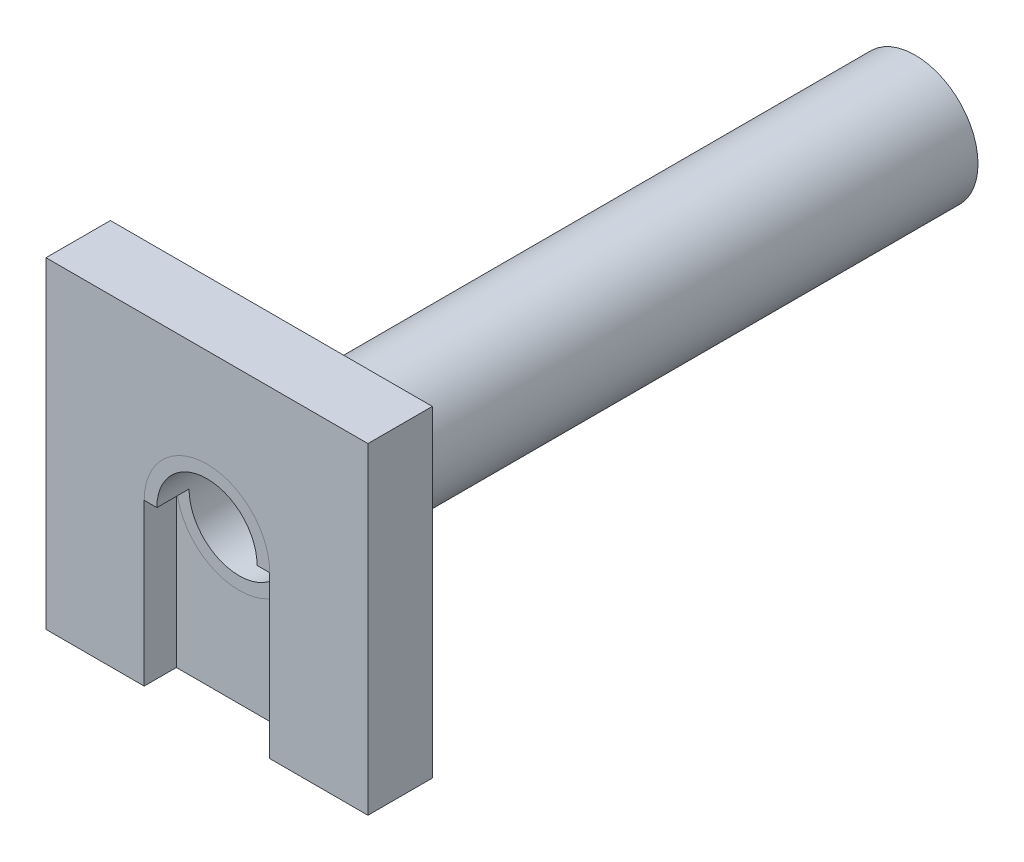
ISO-10303-21;
HEADER;
FILE_DESCRIPTION(('STEP AP214'),'2;1');
FILE_NAME('part.step','',(''),(''),'','','');
FILE_SCHEMA(('AUTOMOTIVE_DESIGN { 1 0 10303 214 1 1 1 1 }'));
ENDSEC;
DATA;
#1=APPLICATION_CONTEXT('core data for automotive mechanical design processes');
#2=APPLICATION_PROTOCOL_DEFINITION('international standard','automotive_design',2000,#1);
#3=PRODUCT_CONTEXT('',#1,'mechanical');
#4=PRODUCT('Part','Part','',(#3));
#5=PRODUCT_RELATED_PRODUCT_CATEGORY('part','',(#4));
#6=PRODUCT_DEFINITION_FORMATION('','',#4);
#7=PRODUCT_DEFINITION_CONTEXT('part definition',#1,'design');
#8=PRODUCT_DEFINITION('design','',#6,#7);
#9=PRODUCT_DEFINITION_SHAPE('','',#8);
#10=(LENGTH_UNIT() NAMED_UNIT(*) SI_UNIT(.MILLI.,.METRE.));
#11=(NAMED_UNIT(*) PLANE_ANGLE_UNIT() SI_UNIT($,.RADIAN.));
#12=(NAMED_UNIT(*) SI_UNIT($,.STERADIAN.) SOLID_ANGLE_UNIT());
#13=UNCERTAINTY_MEASURE_WITH_UNIT(LENGTH_MEASURE(1.E-05),#10,'distance_accuracy_value','');
#14=(GEOMETRIC_REPRESENTATION_CONTEXT(3) GLOBAL_UNCERTAINTY_ASSIGNED_CONTEXT((#13)) GLOBAL_UNIT_ASSIGNED_CONTEXT((#10,
#11,#12)) REPRESENTATION_CONTEXT('',''));
#15=CARTESIAN_POINT('',(0.,0.,0.));
#16=DIRECTION('',(0.,0.,1.));
#17=DIRECTION('',(1.,0.,0.));
#18=AXIS2_PLACEMENT_3D('',#15,#16,#17);
#19=CARTESIAN_POINT('',(-9.68665057002543,-7.7,50.8));
#20=DIRECTION('',(0.,1.,0.));
#21=DIRECTION('',(-1.,0.,0.));
#22=AXIS2_PLACEMENT_3D('',#19,#20,#21);
#23=PLANE('',#22);
#24=DIRECTION('',(0.,0.,1.));
#25=VECTOR('',#24,1.);
#26=CARTESIAN_POINT('',(4.953,-7.7,53.34));
#27=LINE('',#26,#25);
#28=CARTESIAN_POINT('',(4.953,-7.7,53.34));
#29=VERTEX_POINT('',#28);
#30=CARTESIAN_POINT('',(4.953,-7.7,55.88));
#31=VERTEX_POINT('',#30);
#32=EDGE_CURVE('E135',#29,#31,#27,.T.);
#33=ORIENTED_EDGE('',*,*,#32,.F.);
#34=DIRECTION('',(-1.,0.,0.));
#35=VECTOR('',#34,1.);
#36=CARTESIAN_POINT('',(4.953,-7.7,53.34));
#37=LINE('',#36,#35);
#38=CARTESIAN_POINT('',(-4.953,-7.7,53.34));
#39=VERTEX_POINT('',#38);
#40=EDGE_CURVE('E121',#29,#39,#37,.T.);
#41=ORIENTED_EDGE('',*,*,#40,.T.);
#42=DIRECTION('',(0.,0.,1.));
#43=VECTOR('',#42,1.);
#44=CARTESIAN_POINT('',(-4.953,-7.7,53.34));
#45=LINE('',#44,#43);
#46=CARTESIAN_POINT('',(-4.953,-7.7,55.88));
#47=VERTEX_POINT('',#46);
#48=EDGE_CURVE('E139',#39,#47,#45,.T.);
#49=ORIENTED_EDGE('',*,*,#48,.T.);
#50=DIRECTION('',(-1.,0.,0.));
#51=VECTOR('',#50,1.);
#52=CARTESIAN_POINT('',(-9.68665057002543,-7.7,55.88));
#53=LINE('',#52,#51);
#54=CARTESIAN_POINT('',(-12.7,-7.7,55.88));
#55=VERTEX_POINT('',#54);
#56=EDGE_CURVE('E161',#47,#55,#53,.T.);
#57=ORIENTED_EDGE('',*,*,#56,.T.);
#58=DIRECTION('',(0.,0.,1.));
#59=VECTOR('',#58,1.);
#60=CARTESIAN_POINT('',(-12.7,-7.7,50.8));
#61=LINE('',#60,#59);
#62=CARTESIAN_POINT('',(-12.7,-7.7,50.8));
#63=VERTEX_POINT('',#62);
#64=EDGE_CURVE('E159',#63,#55,#61,.T.);
#65=ORIENTED_EDGE('',*,*,#64,.F.);
#66=DIRECTION('',(-1.,0.,0.));
#67=VECTOR('',#66,1.);
#68=CARTESIAN_POINT('',(-9.68665057002543,-7.7,50.8));
#69=LINE('',#68,#67);
#70=CARTESIAN_POINT('',(12.7,-7.69999999999999,50.8));
#71=VERTEX_POINT('',#70);
#72=EDGE_CURVE('E92',#71,#63,#69,.T.);
#73=ORIENTED_EDGE('',*,*,#72,.F.);
#74=DIRECTION('',(0.,0.,1.));
#75=VECTOR('',#74,1.);
#76=CARTESIAN_POINT('',(12.7,-7.69999999999999,50.8));
#77=LINE('',#76,#75);
#78=CARTESIAN_POINT('',(12.7,-7.69999999999999,55.88));
#79=VERTEX_POINT('',#78);
#80=EDGE_CURVE('E175',#71,#79,#77,.T.);
#81=ORIENTED_EDGE('',*,*,#80,.T.);
#82=EDGE_CURVE('E162',#79,#31,#53,.T.);
#83=ORIENTED_EDGE('',*,*,#82,.T.);
#84=EDGE_LOOP('',(#33,#41,#49,#57,#65,#73,#81,#83));
#85=FACE_BOUND('',#84,.T.);
#86=ADVANCED_FACE('F42',(#85),#23,.F.);
#87=CARTESIAN_POINT('',(0.,5.,50.8));
#88=DIRECTION('',(0.,0.,1.));
#89=DIRECTION('',(1.,0.,0.));
#90=AXIS2_PLACEMENT_3D('',#87,#88,#89);
#91=CYLINDRICAL_SURFACE('',#90,4.953);
#92=CARTESIAN_POINT('',(0.,5.,50.8));
#93=DIRECTION('',(0.,0.,1.));
#94=DIRECTION('',(1.,0.,0.));
#95=AXIS2_PLACEMENT_3D('',#92,#93,#94);
#96=CIRCLE('',#95,4.953);
#97=CARTESIAN_POINT('',(4.953,5.,50.8));
#98=VERTEX_POINT('',#97);
#99=EDGE_CURVE('E156',#98,#98,#96,.T.);
#100=ORIENTED_EDGE('',*,*,#99,.F.);
#101=EDGE_LOOP('',(#100));
#102=FACE_BOUND('',#101,.T.);
#103=DIRECTION('',(0.,0.,1.));
#104=VECTOR('',#103,1.);
#105=CARTESIAN_POINT('',(4.953,5.,53.34));
#106=LINE('',#105,#104);
#107=CARTESIAN_POINT('',(4.953,5.,53.34));
#108=VERTEX_POINT('',#107);
#109=CARTESIAN_POINT('',(4.953,5.,55.88));
#110=VERTEX_POINT('',#109);
#111=EDGE_CURVE('E127',#108,#110,#106,.T.);
#112=ORIENTED_EDGE('',*,*,#111,.T.);
#113=CARTESIAN_POINT('',(0.,5.,55.88));
#114=DIRECTION('',(0.,0.,1.));
#115=DIRECTION('',(1.,0.,0.));
#116=AXIS2_PLACEMENT_3D('',#113,#114,#115);
#117=CIRCLE('',#116,4.953);
#118=CARTESIAN_POINT('',(-4.953,5.,55.88));
#119=VERTEX_POINT('',#118);
#120=EDGE_CURVE('E138',#110,#119,#117,.T.);
#121=ORIENTED_EDGE('',*,*,#120,.T.);
#122=DIRECTION('',(0.,0.,1.));
#123=VECTOR('',#122,1.);
#124=CARTESIAN_POINT('',(-4.953,5.,53.34));
#125=LINE('',#124,#123);
#126=CARTESIAN_POINT('',(-4.953,5.,53.34));
#127=VERTEX_POINT('',#126);
#128=EDGE_CURVE('E57',#127,#119,#125,.T.);
#129=ORIENTED_EDGE('',*,*,#128,.F.);
#130=CARTESIAN_POINT('',(0.,5.,53.34));
#131=DIRECTION('',(0.,0.,-1.));
#132=DIRECTION('',(-1.,0.,0.));
#133=AXIS2_PLACEMENT_3D('',#130,#131,#132);
#134=CIRCLE('',#133,4.953);
#135=EDGE_CURVE('E12',#127,#108,#134,.F.);
#136=ORIENTED_EDGE('',*,*,#135,.T.);
#137=EDGE_LOOP('',(#112,#121,#129,#136));
#138=FACE_BOUND('',#137,.T.);
#139=ADVANCED_FACE('F137',(#102,#138),#91,.F.);
#140=CARTESIAN_POINT('',(-9.68665057002542,-55.3680344537397,55.88));
#141=DIRECTION('',(0.,0.,1.));
#142=DIRECTION('',(1.,0.,0.));
#143=AXIS2_PLACEMENT_3D('',#140,#141,#142);
#144=PLANE('',#143);
#145=ORIENTED_EDGE('',*,*,#120,.F.);
#146=DIRECTION('',(0.,-1.,0.));
#147=VECTOR('',#146,1.);
#148=CARTESIAN_POINT('',(4.953,5.,55.88));
#149=LINE('',#148,#147);
#150=EDGE_CURVE('E130',#110,#31,#149,.T.);
#151=ORIENTED_EDGE('',*,*,#150,.T.);
#152=ORIENTED_EDGE('',*,*,#82,.F.);
#153=DIRECTION('',(0.,1.,0.));
#154=VECTOR('',#153,1.);
#155=CARTESIAN_POINT('',(12.7,-55.3680344537397,55.88));
#156=LINE('',#155,#154);
#157=CARTESIAN_POINT('',(12.7,17.7,55.88));
#158=VERTEX_POINT('',#157);
#159=EDGE_CURVE('E165',#79,#158,#156,.T.);
#160=ORIENTED_EDGE('',*,*,#159,.T.);
#161=DIRECTION('',(-1.,0.,0.));
#162=VECTOR('',#161,1.);
#163=CARTESIAN_POINT('',(-9.68665057002542,17.7,55.88));
#164=LINE('',#163,#162);
#165=CARTESIAN_POINT('',(-12.7,17.7,55.88));
#166=VERTEX_POINT('',#165);
#167=EDGE_CURVE('E168',#158,#166,#164,.T.);
#168=ORIENTED_EDGE('',*,*,#167,.T.);
#169=DIRECTION('',(0.,1.,0.));
#170=VECTOR('',#169,1.);
#171=CARTESIAN_POINT('',(-12.7,-55.3680344537397,55.88));
#172=LINE('',#171,#170);
#173=EDGE_CURVE('E134',#55,#166,#172,.T.);
#174=ORIENTED_EDGE('',*,*,#173,.F.);
#175=ORIENTED_EDGE('',*,*,#56,.F.);
#176=DIRECTION('',(0.,1.,0.));
#177=VECTOR('',#176,1.);
#178=CARTESIAN_POINT('',(-4.953,-7.7,55.88));
#179=LINE('',#178,#177);
#180=EDGE_CURVE('E124',#47,#119,#179,.T.);
#181=ORIENTED_EDGE('',*,*,#180,.T.);
#182=EDGE_LOOP('',(#145,#151,#152,#160,#168,#174,#175,#181));
#183=FACE_BOUND('',#182,.T.);
#184=ADVANCED_FACE('F182',(#183),#144,.T.);
#185=CARTESIAN_POINT('',(-12.7,-55.3680344537397,50.8));
#186=DIRECTION('',(1.,0.,0.));
#187=DIRECTION('',(0.,0.,-1.));
#188=AXIS2_PLACEMENT_3D('',#185,#186,#187);
#189=PLANE('',#188);
#190=ORIENTED_EDGE('',*,*,#173,.T.);
#191=DIRECTION('',(0.,0.,1.));
#192=VECTOR('',#191,1.);
#193=CARTESIAN_POINT('',(-12.7,17.7,50.8));
#194=LINE('',#193,#192);
#195=CARTESIAN_POINT('',(-12.7,17.7,50.8));
#196=VERTEX_POINT('',#195);
#197=EDGE_CURVE('E50',#196,#166,#194,.T.);
#198=ORIENTED_EDGE('',*,*,#197,.F.);
#199=DIRECTION('',(0.,1.,0.));
#200=VECTOR('',#199,1.);
#201=CARTESIAN_POINT('',(-12.7,-55.3680344537397,50.8));
#202=LINE('',#201,#200);
#203=EDGE_CURVE('E66',#63,#196,#202,.T.);
#204=ORIENTED_EDGE('',*,*,#203,.F.);
#205=ORIENTED_EDGE('',*,*,#64,.T.);
#206=EDGE_LOOP('',(#190,#198,#204,#205));
#207=FACE_BOUND('',#206,.T.);
#208=ADVANCED_FACE('F44',(#207),#189,.F.);
#209=CARTESIAN_POINT('',(-9.68665057002542,17.7,50.8));
#210=DIRECTION('',(0.,1.,0.));
#211=DIRECTION('',(0.,0.,1.));
#212=AXIS2_PLACEMENT_3D('',#209,#210,#211);
#213=PLANE('',#212);
#214=ORIENTED_EDGE('',*,*,#167,.F.);
#215=DIRECTION('',(0.,0.,1.));
#216=VECTOR('',#215,1.);
#217=CARTESIAN_POINT('',(12.7,17.7,50.8));
#218=LINE('',#217,#216);
#219=CARTESIAN_POINT('',(12.7,17.7,50.8));
#220=VERTEX_POINT('',#219);
#221=EDGE_CURVE('E173',#220,#158,#218,.T.);
#222=ORIENTED_EDGE('',*,*,#221,.F.);
#223=DIRECTION('',(-1.,0.,0.));
#224=VECTOR('',#223,1.);
#225=CARTESIAN_POINT('',(-9.68665057002542,17.7,50.8));
#226=LINE('',#225,#224);
#227=EDGE_CURVE('E154',#220,#196,#226,.T.);
#228=ORIENTED_EDGE('',*,*,#227,.T.);
#229=ORIENTED_EDGE('',*,*,#197,.T.);
#230=EDGE_LOOP('',(#214,#222,#228,#229));
#231=FACE_BOUND('',#230,.T.);
#232=ADVANCED_FACE('F185',(#231),#213,.T.);
#233=CARTESIAN_POINT('',(12.7,-55.3680344537397,50.8));
#234=DIRECTION('',(1.,0.,0.));
#235=DIRECTION('',(0.,0.,-1.));
#236=AXIS2_PLACEMENT_3D('',#233,#234,#235);
#237=PLANE('',#236);
#238=ORIENTED_EDGE('',*,*,#159,.F.);
#239=ORIENTED_EDGE('',*,*,#80,.F.);
#240=DIRECTION('',(0.,1.,0.));
#241=VECTOR('',#240,1.);
#242=CARTESIAN_POINT('',(12.7,-55.3680344537397,50.8));
#243=LINE('',#242,#241);
#244=EDGE_CURVE('E151',#71,#220,#243,.T.);
#245=ORIENTED_EDGE('',*,*,#244,.T.);
#246=ORIENTED_EDGE('',*,*,#221,.T.);
#247=EDGE_LOOP('',(#238,#239,#245,#246));
#248=FACE_BOUND('',#247,.T.);
#249=ADVANCED_FACE('F187',(#248),#237,.T.);
#250=CARTESIAN_POINT('',(-9.68665057002542,-55.3680344537397,50.8));
#251=DIRECTION('',(0.,0.,1.));
#252=DIRECTION('',(1.,0.,0.));
#253=AXIS2_PLACEMENT_3D('',#250,#251,#252);
#254=PLANE('',#253);
#255=ORIENTED_EDGE('',*,*,#203,.T.);
#256=ORIENTED_EDGE('',*,*,#227,.F.);
#257=ORIENTED_EDGE('',*,*,#244,.F.);
#258=ORIENTED_EDGE('',*,*,#72,.T.);
#259=EDGE_LOOP('',(#255,#256,#257,#258));
#260=FACE_BOUND('',#259,.T.);
#261=ORIENTED_EDGE('',*,*,#99,.T.);
#262=EDGE_LOOP('',(#261));
#263=FACE_BOUND('',#262,.T.);
#264=ADVANCED_FACE('F188',(#260,#263),#254,.F.);
#265=CARTESIAN_POINT('',(4.953,5.,53.34));
#266=DIRECTION('',(0.,0.,-1.));
#267=DIRECTION('',(-1.,0.,0.));
#268=AXIS2_PLACEMENT_3D('',#265,#266,#267);
#269=PLANE('',#268);
#270=DIRECTION('',(0.,1.,0.));
#271=VECTOR('',#270,1.);
#272=CARTESIAN_POINT('',(-4.953,-7.7,53.34));
#273=LINE('',#272,#271);
#274=EDGE_CURVE('E140',#39,#127,#273,.T.);
#275=ORIENTED_EDGE('',*,*,#274,.F.);
#276=ORIENTED_EDGE('',*,*,#40,.F.);
#277=DIRECTION('',(0.,-1.,0.));
#278=VECTOR('',#277,1.);
#279=CARTESIAN_POINT('',(4.953,5.,53.34));
#280=LINE('',#279,#278);
#281=EDGE_CURVE('E116',#108,#29,#280,.T.);
#282=ORIENTED_EDGE('',*,*,#281,.F.);
#283=ORIENTED_EDGE('',*,*,#135,.F.);
#284=EDGE_LOOP('',(#275,#276,#282,#283));
#285=FACE_BOUND('',#284,.T.);
#286=ADVANCED_FACE('F119',(#285),#269,.F.);
#287=CARTESIAN_POINT('',(4.953,5.,53.34));
#288=DIRECTION('',(-1.,0.,0.));
#289=DIRECTION('',(0.,-1.,0.));
#290=AXIS2_PLACEMENT_3D('',#287,#288,#289);
#291=PLANE('',#290);
#292=ORIENTED_EDGE('',*,*,#150,.F.);
#293=ORIENTED_EDGE('',*,*,#111,.F.);
#294=ORIENTED_EDGE('',*,*,#281,.T.);
#295=ORIENTED_EDGE('',*,*,#32,.T.);
#296=EDGE_LOOP('',(#292,#293,#294,#295));
#297=FACE_BOUND('',#296,.T.);
#298=ADVANCED_FACE('F128',(#297),#291,.T.);
#299=CARTESIAN_POINT('',(-4.953,-7.7,53.34));
#300=DIRECTION('',(1.,0.,0.));
#301=DIRECTION('',(0.,0.,-1.));
#302=AXIS2_PLACEMENT_3D('',#299,#300,#301);
#303=PLANE('',#302);
#304=ORIENTED_EDGE('',*,*,#180,.F.);
#305=ORIENTED_EDGE('',*,*,#48,.F.);
#306=ORIENTED_EDGE('',*,*,#274,.T.);
#307=ORIENTED_EDGE('',*,*,#128,.T.);
#308=EDGE_LOOP('',(#304,#305,#306,#307));
#309=FACE_BOUND('',#308,.T.);
#310=ADVANCED_FACE('F228',(#309),#303,.T.);
#311=CLOSED_SHELL('',(#86,#139,#184,#208,#232,#249,#264,#286,#298,#310));
#312=MANIFOLD_SOLID_BREP('B2',#311);
#313=CARTESIAN_POINT('',(0.,5.,55.88));
#314=DIRECTION('',(0.,0.,1.));
#315=DIRECTION('',(1.,0.,0.));
#316=AXIS2_PLACEMENT_3D('',#313,#314,#315);
#317=PLANE('',#316);
#318=CARTESIAN_POINT('',(0.,5.,55.88));
#319=DIRECTION('',(0.,0.,1.));
#320=DIRECTION('',(1.,0.,0.));
#321=AXIS2_PLACEMENT_3D('',#318,#319,#320);
#322=CIRCLE('',#321,4.953);
#323=CARTESIAN_POINT('',(4.953,5.,55.88));
#324=VERTEX_POINT('',#323);
#325=CARTESIAN_POINT('',(-4.953,5.,55.88));
#326=VERTEX_POINT('',#325);
#327=EDGE_CURVE('E331',#324,#326,#322,.T.);
#328=ORIENTED_EDGE('',*,*,#327,.T.);
#329=DIRECTION('',(1.,0.,0.));
#330=VECTOR('',#329,1.);
#331=CARTESIAN_POINT('',(-4.953,5.,55.88));
#332=LINE('',#331,#330);
#333=CARTESIAN_POINT('',(-3.953,5.,55.88));
#334=VERTEX_POINT('',#333);
#335=EDGE_CURVE('E326',#326,#334,#332,.T.);
#336=ORIENTED_EDGE('',*,*,#335,.T.);
#337=CARTESIAN_POINT('',(0.,5.,55.88));
#338=DIRECTION('',(0.,0.,1.));
#339=DIRECTION('',(1.,0.,0.));
#340=AXIS2_PLACEMENT_3D('',#337,#338,#339);
#341=CIRCLE('',#340,3.953);
#342=CARTESIAN_POINT('',(3.953,5.,55.88));
#343=VERTEX_POINT('',#342);
#344=EDGE_CURVE('E337',#343,#334,#341,.T.);
#345=ORIENTED_EDGE('',*,*,#344,.F.);
#346=EDGE_CURVE('E351',#343,#324,#332,.T.);
#347=ORIENTED_EDGE('',*,*,#346,.T.);
#348=EDGE_LOOP('',(#328,#336,#345,#347));
#349=FACE_BOUND('',#348,.T.);
#350=ADVANCED_FACE('F274',(#349),#317,.T.);
#351=CARTESIAN_POINT('',(0.,5.,55.88));
#352=DIRECTION('',(0.,0.,-1.));
#353=DIRECTION('',(-1.,0.,0.));
#354=AXIS2_PLACEMENT_3D('',#351,#352,#353);
#355=CYLINDRICAL_SURFACE('',#354,3.953);
#356=CARTESIAN_POINT('',(0.,5.,0.));
#357=DIRECTION('',(0.,0.,1.));
#358=DIRECTION('',(1.,0.,0.));
#359=AXIS2_PLACEMENT_3D('',#356,#357,#358);
#360=CIRCLE('',#359,3.953);
#361=CARTESIAN_POINT('',(3.953,5.,0.));
#362=VERTEX_POINT('',#361);
#363=EDGE_CURVE('E319',#362,#362,#360,.T.);
#364=ORIENTED_EDGE('',*,*,#363,.F.);
#365=EDGE_LOOP('',(#364));
#366=FACE_BOUND('',#365,.T.);
#367=ORIENTED_EDGE('',*,*,#344,.T.);
#368=DIRECTION('',(0.,0.,-1.));
#369=VECTOR('',#368,1.);
#370=CARTESIAN_POINT('',(-3.953,5.,55.88));
#371=LINE('',#370,#369);
#372=CARTESIAN_POINT('',(-3.953,5.,53.34));
#373=VERTEX_POINT('',#372);
#374=EDGE_CURVE('E40',#334,#373,#371,.T.);
#375=ORIENTED_EDGE('',*,*,#374,.T.);
#376=CARTESIAN_POINT('',(0.,5.,53.34));
#377=DIRECTION('',(0.,0.,-1.));
#378=DIRECTION('',(-1.,0.,0.));
#379=AXIS2_PLACEMENT_3D('',#376,#377,#378);
#380=CIRCLE('',#379,3.953);
#381=CARTESIAN_POINT('',(3.953,5.,53.34));
#382=VERTEX_POINT('',#381);
#383=EDGE_CURVE('E294',#382,#373,#380,.T.);
#384=ORIENTED_EDGE('',*,*,#383,.F.);
#385=DIRECTION('',(0.,0.,-1.));
#386=VECTOR('',#385,1.);
#387=CARTESIAN_POINT('',(3.953,5.,55.88));
#388=LINE('',#387,#386);
#389=EDGE_CURVE('E282',#382,#343,#388,.F.);
#390=ORIENTED_EDGE('',*,*,#389,.T.);
#391=EDGE_LOOP('',(#367,#375,#384,#390));
#392=FACE_BOUND('',#391,.T.);
#393=ADVANCED_FACE('F348',(#366,#392),#355,.F.);
#394=CARTESIAN_POINT('',(0.,5.,0.));
#395=DIRECTION('',(0.,0.,1.));
#396=DIRECTION('',(1.,0.,0.));
#397=AXIS2_PLACEMENT_3D('',#394,#395,#396);
#398=PLANE('',#397);
#399=CARTESIAN_POINT('',(0.,5.,0.));
#400=DIRECTION('',(0.,0.,1.));
#401=DIRECTION('',(1.,0.,0.));
#402=AXIS2_PLACEMENT_3D('',#399,#400,#401);
#403=CIRCLE('',#402,4.953);
#404=CARTESIAN_POINT('',(4.953,5.,0.));
#405=VERTEX_POINT('',#404);
#406=EDGE_CURVE('E340',#405,#405,#403,.T.);
#407=ORIENTED_EDGE('',*,*,#406,.F.);
#408=EDGE_LOOP('',(#407));
#409=FACE_BOUND('',#408,.T.);
#410=ORIENTED_EDGE('',*,*,#363,.T.);
#411=EDGE_LOOP('',(#410));
#412=FACE_BOUND('',#411,.T.);
#413=ADVANCED_FACE('F361',(#409,#412),#398,.F.);
#414=CARTESIAN_POINT('',(0.,5.,55.88));
#415=DIRECTION('',(0.,0.,-1.));
#416=DIRECTION('',(-1.,0.,0.));
#417=AXIS2_PLACEMENT_3D('',#414,#415,#416);
#418=CYLINDRICAL_SURFACE('',#417,4.953);
#419=ORIENTED_EDGE('',*,*,#327,.F.);
#420=DIRECTION('',(0.,0.,1.));
#421=VECTOR('',#420,1.);
#422=CARTESIAN_POINT('',(4.953,5.,53.34));
#423=LINE('',#422,#421);
#424=CARTESIAN_POINT('',(4.953,5.,53.34));
#425=VERTEX_POINT('',#424);
#426=EDGE_CURVE('E320',#425,#324,#423,.T.);
#427=ORIENTED_EDGE('',*,*,#426,.F.);
#428=CARTESIAN_POINT('',(0.,5.,53.34));
#429=DIRECTION('',(0.,0.,-1.));
#430=DIRECTION('',(-1.,0.,0.));
#431=AXIS2_PLACEMENT_3D('',#428,#429,#430);
#432=CIRCLE('',#431,4.953);
#433=CARTESIAN_POINT('',(-4.953,5.,53.34));
#434=VERTEX_POINT('',#433);
#435=EDGE_CURVE('E313',#425,#434,#432,.T.);
#436=ORIENTED_EDGE('',*,*,#435,.T.);
#437=DIRECTION('',(0.,0.,1.));
#438=VECTOR('',#437,1.);
#439=CARTESIAN_POINT('',(-4.953,5.,53.34));
#440=LINE('',#439,#438);
#441=EDGE_CURVE('E332',#434,#326,#440,.T.);
#442=ORIENTED_EDGE('',*,*,#441,.T.);
#443=EDGE_LOOP('',(#419,#427,#436,#442));
#444=FACE_BOUND('',#443,.T.);
#445=ORIENTED_EDGE('',*,*,#406,.T.);
#446=EDGE_LOOP('',(#445));
#447=FACE_BOUND('',#446,.T.);
#448=ADVANCED_FACE('F276',(#444,#447),#418,.T.);
#449=CARTESIAN_POINT('',(-4.953,5.,53.34));
#450=DIRECTION('',(0.,-1.,0.));
#451=DIRECTION('',(0.,0.,-1.));
#452=AXIS2_PLACEMENT_3D('',#449,#450,#451);
#453=PLANE('',#452);
#454=ORIENTED_EDGE('',*,*,#335,.F.);
#455=ORIENTED_EDGE('',*,*,#441,.F.);
#456=DIRECTION('',(1.,0.,0.));
#457=VECTOR('',#456,1.);
#458=CARTESIAN_POINT('',(-4.953,5.,53.34));
#459=LINE('',#458,#457);
#460=EDGE_CURVE('E315',#434,#373,#459,.T.);
#461=ORIENTED_EDGE('',*,*,#460,.T.);
#462=ORIENTED_EDGE('',*,*,#374,.F.);
#463=EDGE_LOOP('',(#454,#455,#461,#462));
#464=FACE_BOUND('',#463,.T.);
#465=ADVANCED_FACE('F353',(#464),#453,.T.);
#466=CARTESIAN_POINT('',(4.953,5.,53.34));
#467=DIRECTION('',(0.,0.,-1.));
#468=DIRECTION('',(-1.,0.,0.));
#469=AXIS2_PLACEMENT_3D('',#466,#467,#468);
#470=PLANE('',#469);
#471=EDGE_CURVE('E289',#382,#425,#459,.T.);
#472=ORIENTED_EDGE('',*,*,#471,.F.);
#473=ORIENTED_EDGE('',*,*,#383,.T.);
#474=ORIENTED_EDGE('',*,*,#460,.F.);
#475=ORIENTED_EDGE('',*,*,#435,.F.);
#476=EDGE_LOOP('',(#472,#473,#474,#475));
#477=FACE_BOUND('',#476,.T.);
#478=ADVANCED_FACE('F314',(#477),#470,.F.);
#479=ORIENTED_EDGE('',*,*,#471,.T.);
#480=ORIENTED_EDGE('',*,*,#426,.T.);
#481=ORIENTED_EDGE('',*,*,#346,.F.);
#482=ORIENTED_EDGE('',*,*,#389,.F.);
#483=EDGE_LOOP('',(#479,#480,#481,#482));
#484=FACE_BOUND('',#483,.T.);
#485=ADVANCED_FACE('F323',(#484),#453,.T.);
#486=CLOSED_SHELL('',(#350,#393,#413,#448,#465,#478,#485));
#487=MANIFOLD_SOLID_BREP('B6',#486);
#488=ADVANCED_BREP_SHAPE_REPRESENTATION('',(#18,#312,#487),#14);
#489=SHAPE_DEFINITION_REPRESENTATION(#9,#488);
ENDSEC;
END-ISO-10303-21;
